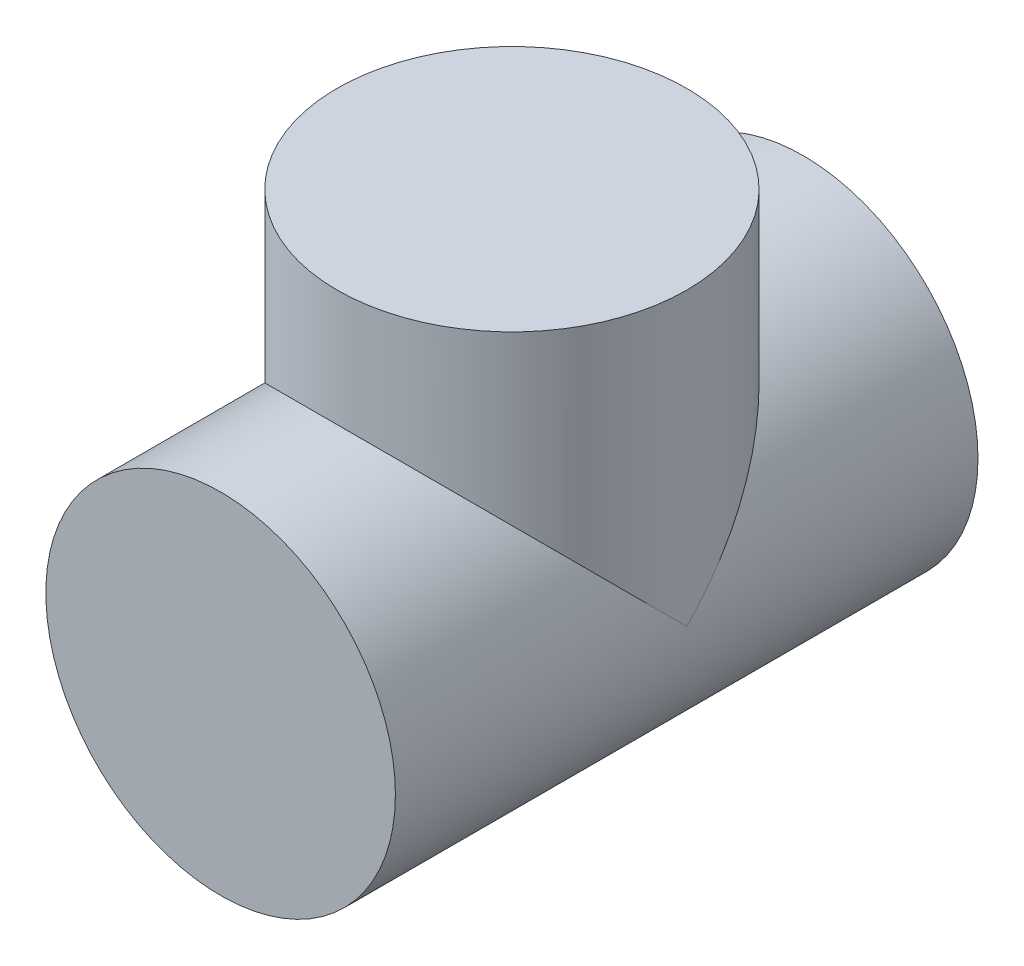
ISO-10303-21;
HEADER;
FILE_DESCRIPTION(('STEP AP214'),'2;1');
FILE_NAME('part.step','',(''),(''),'','','');
FILE_SCHEMA(('AUTOMOTIVE_DESIGN { 1 0 10303 214 1 1 1 1 }'));
ENDSEC;
DATA;
#1=APPLICATION_CONTEXT('core data for automotive mechanical design processes');
#2=APPLICATION_PROTOCOL_DEFINITION('international standard','automotive_design',2000,#1);
#3=PRODUCT_CONTEXT('',#1,'mechanical');
#4=PRODUCT('Part','Part','',(#3));
#5=PRODUCT_RELATED_PRODUCT_CATEGORY('part','',(#4));
#6=PRODUCT_DEFINITION_FORMATION('','',#4);
#7=PRODUCT_DEFINITION_CONTEXT('part definition',#1,'design');
#8=PRODUCT_DEFINITION('design','',#6,#7);
#9=PRODUCT_DEFINITION_SHAPE('','',#8);
#10=(LENGTH_UNIT() NAMED_UNIT(*) SI_UNIT(.MILLI.,.METRE.));
#11=(NAMED_UNIT(*) PLANE_ANGLE_UNIT() SI_UNIT($,.RADIAN.));
#12=(NAMED_UNIT(*) SI_UNIT($,.STERADIAN.) SOLID_ANGLE_UNIT());
#13=UNCERTAINTY_MEASURE_WITH_UNIT(LENGTH_MEASURE(1.E-05),#10,'distance_accuracy_value','');
#14=(GEOMETRIC_REPRESENTATION_CONTEXT(3) GLOBAL_UNCERTAINTY_ASSIGNED_CONTEXT((#13)) GLOBAL_UNIT_ASSIGNED_CONTEXT((#10,
#11,#12)) REPRESENTATION_CONTEXT('',''));
#15=CARTESIAN_POINT('',(0.,0.,0.));
#16=DIRECTION('',(0.,0.,1.));
#17=DIRECTION('',(1.,0.,0.));
#18=AXIS2_PLACEMENT_3D('',#15,#16,#17);
#19=CARTESIAN_POINT('',(0.,0.,25.4));
#20=DIRECTION('',(0.,0.,-1.));
#21=DIRECTION('',(-1.,0.,0.));
#22=AXIS2_PLACEMENT_3D('',#19,#20,#21);
#23=CYLINDRICAL_SURFACE('',#22,7.62);
#24=CARTESIAN_POINT('',(0.,0.,0.));
#25=DIRECTION('',(0.,0.,1.));
#26=DIRECTION('',(1.,0.,0.));
#27=AXIS2_PLACEMENT_3D('',#24,#25,#26);
#28=CIRCLE('',#27,7.62);
#29=CARTESIAN_POINT('',(7.62,0.,0.));
#30=VERTEX_POINT('',#29);
#31=EDGE_CURVE('E56',#30,#30,#28,.T.);
#32=ORIENTED_EDGE('',*,*,#31,.T.);
#33=EDGE_LOOP('',(#32));
#34=FACE_BOUND('',#33,.T.);
#35=CARTESIAN_POINT('',(0.,0.,25.4));
#36=DIRECTION('',(0.,0.,1.));
#37=DIRECTION('',(1.,0.,0.));
#38=AXIS2_PLACEMENT_3D('',#35,#36,#37);
#39=CIRCLE('',#38,7.62);
#40=CARTESIAN_POINT('',(7.62,0.,25.4));
#41=VERTEX_POINT('',#40);
#42=EDGE_CURVE('E54',#41,#41,#39,.T.);
#43=ORIENTED_EDGE('',*,*,#42,.F.);
#44=EDGE_LOOP('',(#43));
#45=FACE_BOUND('',#44,.T.);
#46=CARTESIAN_POINT('',(0.,0.,12.7));
#47=DIRECTION('',(0.,-0.707106781186547,-0.707106781186547));
#48=DIRECTION('',(0.,0.707106781186547,-0.707106781186547));
#49=AXIS2_PLACEMENT_3D('',#46,#47,#48);
#50=ELLIPSE('',#49,10.776307345283,7.62);
#51=CARTESIAN_POINT('',(7.62,0.,12.7));
#52=VERTEX_POINT('',#51);
#53=CARTESIAN_POINT('',(-7.62,0.,12.7));
#54=VERTEX_POINT('',#53);
#55=EDGE_CURVE('E11',#52,#54,#50,.F.);
#56=ORIENTED_EDGE('',*,*,#55,.F.);
#57=CARTESIAN_POINT('',(0.,0.,12.7));
#58=DIRECTION('',(0.,0.707106781186547,-0.707106781186547));
#59=DIRECTION('',(0.,-0.707106781186547,-0.707106781186547));
#60=AXIS2_PLACEMENT_3D('',#57,#58,#59);
#61=ELLIPSE('',#60,10.776307345283,7.62);
#62=EDGE_CURVE('E46',#54,#52,#61,.T.);
#63=ORIENTED_EDGE('',*,*,#62,.F.);
#64=EDGE_LOOP('',(#56,#63));
#65=FACE_BOUND('',#64,.T.);
#66=ADVANCED_FACE('F39',(#34,#45,#65),#23,.T.);
#67=CARTESIAN_POINT('',(0.,0.,25.4));
#68=DIRECTION('',(0.,0.,1.));
#69=DIRECTION('',(1.,0.,0.));
#70=AXIS2_PLACEMENT_3D('',#67,#68,#69);
#71=PLANE('',#70);
#72=ORIENTED_EDGE('',*,*,#42,.T.);
#73=EDGE_LOOP('',(#72));
#74=FACE_BOUND('',#73,.T.);
#75=ADVANCED_FACE('F75',(#74),#71,.T.);
#76=CARTESIAN_POINT('',(0.,0.,0.));
#77=DIRECTION('',(0.,0.,1.));
#78=DIRECTION('',(1.,0.,0.));
#79=AXIS2_PLACEMENT_3D('',#76,#77,#78);
#80=PLANE('',#79);
#81=ORIENTED_EDGE('',*,*,#31,.F.);
#82=EDGE_LOOP('',(#81));
#83=FACE_BOUND('',#82,.T.);
#84=ADVANCED_FACE('F68',(#83),#80,.F.);
#85=CARTESIAN_POINT('',(0.,12.7,12.7));
#86=DIRECTION('',(0.,-1.,0.));
#87=DIRECTION('',(0.,0.,-1.));
#88=AXIS2_PLACEMENT_3D('',#85,#86,#87);
#89=CYLINDRICAL_SURFACE('',#88,7.62);
#90=CARTESIAN_POINT('',(0.,12.7,12.7));
#91=DIRECTION('',(0.,1.,0.));
#92=DIRECTION('',(0.,0.,1.));
#93=AXIS2_PLACEMENT_3D('',#90,#91,#92);
#94=CIRCLE('',#93,7.62);
#95=CARTESIAN_POINT('',(0.,12.7,20.32));
#96=VERTEX_POINT('',#95);
#97=EDGE_CURVE('E60',#96,#96,#94,.T.);
#98=ORIENTED_EDGE('',*,*,#97,.F.);
#99=EDGE_LOOP('',(#98));
#100=FACE_BOUND('',#99,.T.);
#101=ORIENTED_EDGE('',*,*,#62,.T.);
#102=ORIENTED_EDGE('',*,*,#55,.T.);
#103=EDGE_LOOP('',(#101,#102));
#104=FACE_BOUND('',#103,.T.);
#105=ADVANCED_FACE('F53',(#100,#104),#89,.T.);
#106=CARTESIAN_POINT('',(0.,12.7,0.));
#107=DIRECTION('',(0.,1.,0.));
#108=DIRECTION('',(0.,0.,1.));
#109=AXIS2_PLACEMENT_3D('',#106,#107,#108);
#110=PLANE('',#109);
#111=ORIENTED_EDGE('',*,*,#97,.T.);
#112=EDGE_LOOP('',(#111));
#113=FACE_BOUND('',#112,.T.);
#114=ADVANCED_FACE('F65',(#113),#110,.T.);
#115=CLOSED_SHELL('',(#66,#75,#84,#105,#114));
#116=MANIFOLD_SOLID_BREP('B2',#115);
#117=ADVANCED_BREP_SHAPE_REPRESENTATION('',(#18,#116),#14);
#118=SHAPE_DEFINITION_REPRESENTATION(#9,#117);
ENDSEC;
END-ISO-10303-21;
